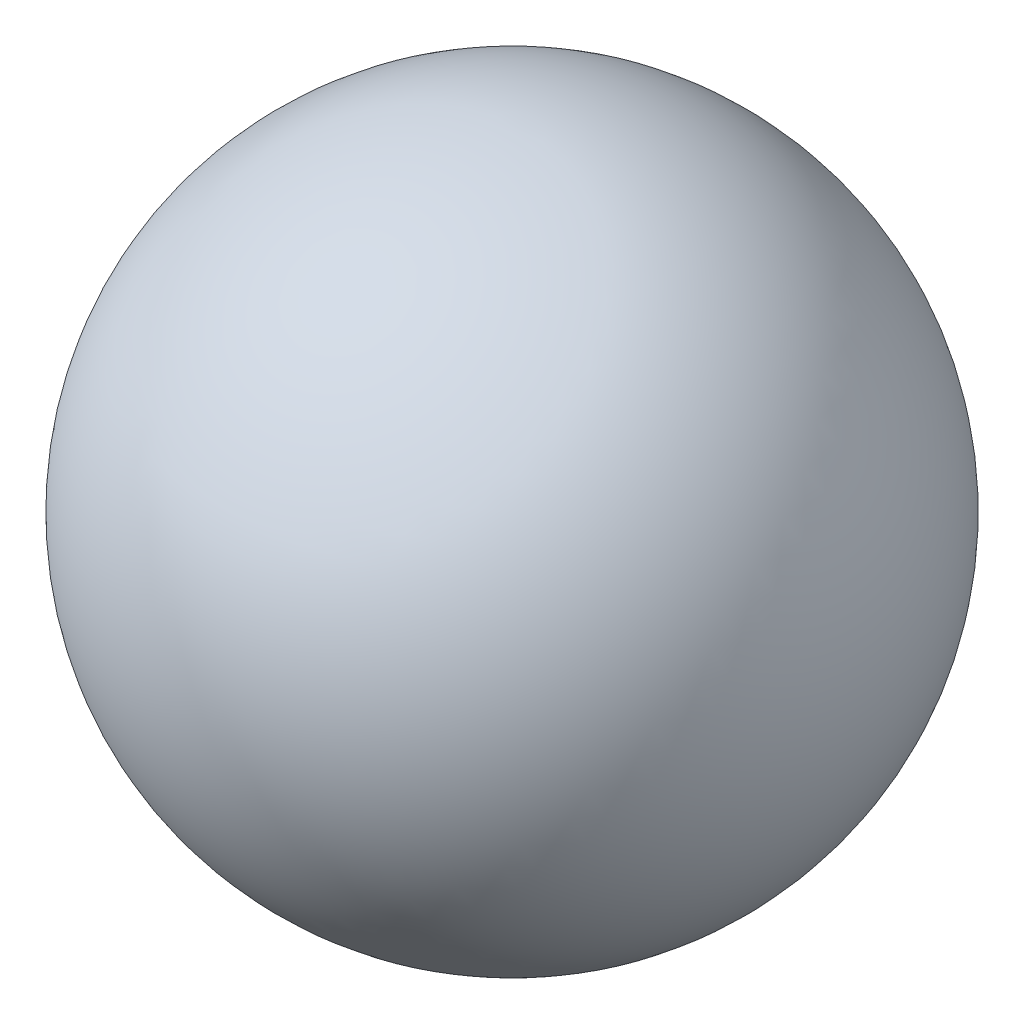
ISO-10303-21;
HEADER;
FILE_DESCRIPTION(('STEP AP214'),'2;1');
FILE_NAME('part.step','',(''),(''),'','','');
FILE_SCHEMA(('AUTOMOTIVE_DESIGN { 1 0 10303 214 1 1 1 1 }'));
ENDSEC;
DATA;
#1=APPLICATION_CONTEXT('core data for automotive mechanical design processes');
#2=APPLICATION_PROTOCOL_DEFINITION('international standard','automotive_design',2000,#1);
#3=PRODUCT_CONTEXT('',#1,'mechanical');
#4=PRODUCT('Part','Part','',(#3));
#5=PRODUCT_RELATED_PRODUCT_CATEGORY('part','',(#4));
#6=PRODUCT_DEFINITION_FORMATION('','',#4);
#7=PRODUCT_DEFINITION_CONTEXT('part definition',#1,'design');
#8=PRODUCT_DEFINITION('design','',#6,#7);
#9=PRODUCT_DEFINITION_SHAPE('','',#8);
#10=(LENGTH_UNIT() NAMED_UNIT(*) SI_UNIT(.MILLI.,.METRE.));
#11=(NAMED_UNIT(*) PLANE_ANGLE_UNIT() SI_UNIT($,.RADIAN.));
#12=(NAMED_UNIT(*) SI_UNIT($,.STERADIAN.) SOLID_ANGLE_UNIT());
#13=UNCERTAINTY_MEASURE_WITH_UNIT(LENGTH_MEASURE(1.E-05),#10,'distance_accuracy_value','');
#14=(GEOMETRIC_REPRESENTATION_CONTEXT(3) GLOBAL_UNCERTAINTY_ASSIGNED_CONTEXT((#13)) GLOBAL_UNIT_ASSIGNED_CONTEXT((#10,
#11,#12)) REPRESENTATION_CONTEXT('',''));
#15=CARTESIAN_POINT('',(0.,0.,0.));
#16=DIRECTION('',(0.,0.,1.));
#17=DIRECTION('',(1.,0.,0.));
#18=AXIS2_PLACEMENT_3D('',#15,#16,#17);
#19=CARTESIAN_POINT('',(0.,8.23997041420119,0.));
#20=DIRECTION('',(0.,1.,0.));
#21=DIRECTION('',(1.,0.,0.));
#22=AXIS2_PLACEMENT_3D('',#19,#20,#21);
#23=SPHERICAL_SURFACE('',#22,17.9490828402367);
#24=CARTESIAN_POINT('',(0.,26.1890532544379,0.));
#25=VERTEX_POINT('',#24);
#26=VERTEX_LOOP('',#25);
#27=FACE_BOUND('',#26,.T.);
#28=ADVANCED_FACE('F29',(#27),#23,.T.);
#29=CLOSED_SHELL('',(#28));
#30=MANIFOLD_SOLID_BREP('B2',#29);
#31=ADVANCED_BREP_SHAPE_REPRESENTATION('',(#18,#30),#14);
#32=SHAPE_DEFINITION_REPRESENTATION(#9,#31);
ENDSEC;
END-ISO-10303-21;
